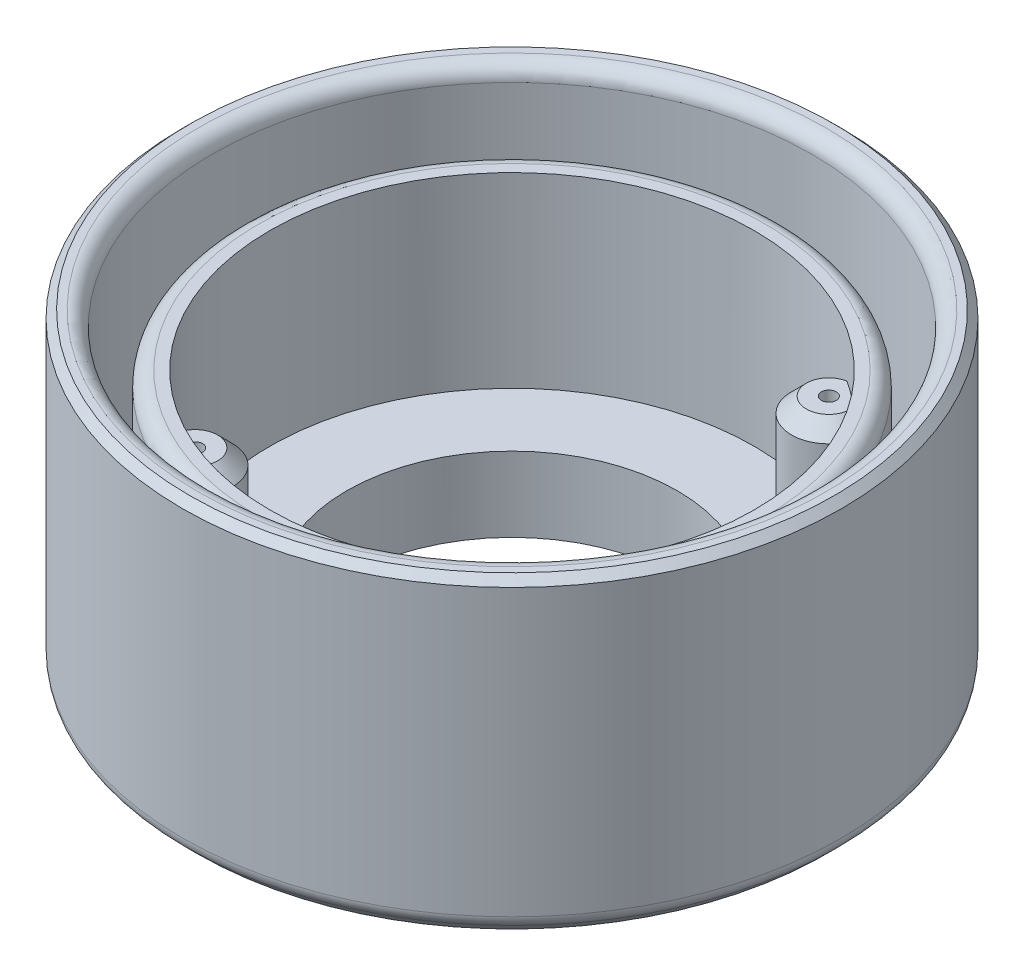
ISO-10303-21;
HEADER;
FILE_DESCRIPTION(('STEP AP214'),'2;1');
FILE_NAME('part.step','',(''),(''),'','','');
FILE_SCHEMA(('AUTOMOTIVE_DESIGN { 1 0 10303 214 1 1 1 1 }'));
ENDSEC;
DATA;
#1=APPLICATION_CONTEXT('core data for automotive mechanical design processes');
#2=APPLICATION_PROTOCOL_DEFINITION('international standard','automotive_design',2000,#1);
#3=PRODUCT_CONTEXT('',#1,'mechanical');
#4=PRODUCT('Part','Part','',(#3));
#5=PRODUCT_RELATED_PRODUCT_CATEGORY('part','',(#4));
#6=PRODUCT_DEFINITION_FORMATION('','',#4);
#7=PRODUCT_DEFINITION_CONTEXT('part definition',#1,'design');
#8=PRODUCT_DEFINITION('design','',#6,#7);
#9=PRODUCT_DEFINITION_SHAPE('','',#8);
#10=(LENGTH_UNIT() NAMED_UNIT(*) SI_UNIT(.MILLI.,.METRE.));
#11=(NAMED_UNIT(*) PLANE_ANGLE_UNIT() SI_UNIT($,.RADIAN.));
#12=(NAMED_UNIT(*) SI_UNIT($,.STERADIAN.) SOLID_ANGLE_UNIT());
#13=UNCERTAINTY_MEASURE_WITH_UNIT(LENGTH_MEASURE(1.E-05),#10,'distance_accuracy_value','');
#14=(GEOMETRIC_REPRESENTATION_CONTEXT(3) GLOBAL_UNCERTAINTY_ASSIGNED_CONTEXT((#13)) GLOBAL_UNIT_ASSIGNED_CONTEXT((#10,
#11,#12)) REPRESENTATION_CONTEXT('',''));
#15=CARTESIAN_POINT('',(0.,0.,0.));
#16=DIRECTION('',(0.,0.,1.));
#17=DIRECTION('',(1.,0.,0.));
#18=AXIS2_PLACEMENT_3D('',#15,#16,#17);
#19=CARTESIAN_POINT('',(9.1,16.001,-12.1));
#20=DIRECTION('',(0.,-1.,0.));
#21=DIRECTION('',(0.,0.,-1.));
#22=AXIS2_PLACEMENT_3D('',#19,#20,#21);
#23=CYLINDRICAL_SURFACE('',#22,0.500000000000001);
#24=CARTESIAN_POINT('',(9.1,0.65470053837925,-12.1));
#25=DIRECTION('',(0.,-1.,0.));
#26=DIRECTION('',(0.,0.,-1.));
#27=AXIS2_PLACEMENT_3D('',#24,#25,#26);
#28=CIRCLE('',#27,0.500000000000001);
#29=CARTESIAN_POINT('',(9.1,0.65470053837925,-12.6));
#30=VERTEX_POINT('',#29);
#31=EDGE_CURVE('E11',#30,#30,#28,.T.);
#32=ORIENTED_EDGE('',*,*,#31,.T.);
#33=EDGE_LOOP('',(#32));
#34=FACE_BOUND('',#33,.T.);
#35=CARTESIAN_POINT('',(9.1,9.5,-12.1));
#36=DIRECTION('',(0.,-1.,0.));
#37=DIRECTION('',(0.,0.,-1.));
#38=AXIS2_PLACEMENT_3D('',#35,#36,#37);
#39=CIRCLE('',#38,0.500000000000001);
#40=CARTESIAN_POINT('',(9.1,9.5,-12.6));
#41=VERTEX_POINT('',#40);
#42=EDGE_CURVE('E116',#41,#41,#39,.T.);
#43=ORIENTED_EDGE('',*,*,#42,.F.);
#44=EDGE_LOOP('',(#43));
#45=FACE_BOUND('',#44,.T.);
#46=ADVANCED_FACE('F35',(#34,#45),#23,.F.);
#47=CARTESIAN_POINT('',(-9.1,16.001,12.1));
#48=DIRECTION('',(0.,-1.,0.));
#49=DIRECTION('',(0.,0.,-1.));
#50=AXIS2_PLACEMENT_3D('',#47,#48,#49);
#51=CYLINDRICAL_SURFACE('',#50,0.500000000000001);
#52=CARTESIAN_POINT('',(-9.1,0.65470053837925,12.1));
#53=DIRECTION('',(0.,-1.,0.));
#54=DIRECTION('',(0.,0.,-1.));
#55=AXIS2_PLACEMENT_3D('',#52,#53,#54);
#56=CIRCLE('',#55,0.500000000000001);
#57=CARTESIAN_POINT('',(-9.1,0.65470053837925,11.6));
#58=VERTEX_POINT('',#57);
#59=EDGE_CURVE('E43',#58,#58,#56,.T.);
#60=ORIENTED_EDGE('',*,*,#59,.T.);
#61=EDGE_LOOP('',(#60));
#62=FACE_BOUND('',#61,.T.);
#63=CARTESIAN_POINT('',(-9.1,9.5,12.1));
#64=DIRECTION('',(0.,-1.,0.));
#65=DIRECTION('',(0.,0.,-1.));
#66=AXIS2_PLACEMENT_3D('',#63,#64,#65);
#67=CIRCLE('',#66,0.500000000000001);
#68=CARTESIAN_POINT('',(-9.1,9.5,11.6));
#69=VERTEX_POINT('',#68);
#70=EDGE_CURVE('E111',#69,#69,#67,.T.);
#71=ORIENTED_EDGE('',*,*,#70,.F.);
#72=EDGE_LOOP('',(#71));
#73=FACE_BOUND('',#72,.T.);
#74=ADVANCED_FACE('F247',(#62,#73),#51,.F.);
#75=CARTESIAN_POINT('',(0.,16.,0.));
#76=DIRECTION('',(0.,-1.,0.));
#77=DIRECTION('',(0.,0.,-1.));
#78=AXIS2_PLACEMENT_3D('',#75,#76,#77);
#79=CYLINDRICAL_SURFACE('',#78,20.05);
#80=CARTESIAN_POINT('',(0.,15.,0.));
#81=DIRECTION('',(0.,1.,0.));
#82=DIRECTION('',(0.,0.,1.));
#83=AXIS2_PLACEMENT_3D('',#80,#81,#82);
#84=CIRCLE('',#83,20.05);
#85=CARTESIAN_POINT('',(0.,15.,20.05));
#86=VERTEX_POINT('',#85);
#87=EDGE_CURVE('E160',#86,#86,#84,.T.);
#88=ORIENTED_EDGE('',*,*,#87,.T.);
#89=EDGE_LOOP('',(#88));
#90=FACE_BOUND('',#89,.T.);
#91=CARTESIAN_POINT('',(0.,0.,0.));
#92=DIRECTION('',(0.,1.,0.));
#93=DIRECTION('',(0.,0.,1.));
#94=AXIS2_PLACEMENT_3D('',#91,#92,#93);
#95=CIRCLE('',#94,20.05);
#96=CARTESIAN_POINT('',(0.,0.,20.05));
#97=VERTEX_POINT('',#96);
#98=EDGE_CURVE('E99',#97,#97,#95,.T.);
#99=ORIENTED_EDGE('',*,*,#98,.F.);
#100=EDGE_LOOP('',(#99));
#101=FACE_BOUND('',#100,.T.);
#102=ADVANCED_FACE('F253',(#90,#101),#79,.F.);
#103=CARTESIAN_POINT('',(0.,16.,0.));
#104=DIRECTION('',(0.,-1.,0.));
#105=DIRECTION('',(0.,0.,-1.));
#106=AXIS2_PLACEMENT_3D('',#103,#104,#105);
#107=CYLINDRICAL_SURFACE('',#106,22.05);
#108=CARTESIAN_POINT('',(0.,15.5,0.));
#109=DIRECTION('',(0.,1.,0.));
#110=DIRECTION('',(0.,0.,1.));
#111=AXIS2_PLACEMENT_3D('',#108,#109,#110);
#112=CIRCLE('',#111,22.05);
#113=CARTESIAN_POINT('',(0.,15.5,22.05));
#114=VERTEX_POINT('',#113);
#115=EDGE_CURVE('E372',#114,#114,#112,.F.);
#116=ORIENTED_EDGE('',*,*,#115,.T.);
#117=EDGE_LOOP('',(#116));
#118=FACE_BOUND('',#117,.T.);
#119=CARTESIAN_POINT('',(0.,-3.5857864376269,0.));
#120=DIRECTION('',(0.,-1.,0.));
#121=DIRECTION('',(0.,0.,-1.));
#122=AXIS2_PLACEMENT_3D('',#119,#120,#121);
#123=CIRCLE('',#122,22.05);
#124=CARTESIAN_POINT('',(0.,-3.5857864376269,-22.05));
#125=VERTEX_POINT('',#124);
#126=EDGE_CURVE('E363',#125,#125,#123,.F.);
#127=ORIENTED_EDGE('',*,*,#126,.T.);
#128=EDGE_LOOP('',(#127));
#129=FACE_BOUND('',#128,.T.);
#130=ADVANCED_FACE('F324',(#118,#129),#107,.T.);
#131=CARTESIAN_POINT('',(0.,16.,0.));
#132=DIRECTION('',(0.,1.,0.));
#133=DIRECTION('',(0.,0.,1.));
#134=AXIS2_PLACEMENT_3D('',#131,#132,#133);
#135=PLANE('',#134);
#136=CARTESIAN_POINT('',(0.,16.,0.));
#137=DIRECTION('',(0.,1.,0.));
#138=DIRECTION('',(0.,0.,1.));
#139=AXIS2_PLACEMENT_3D('',#136,#137,#138);
#140=CIRCLE('',#139,21.55);
#141=CARTESIAN_POINT('',(0.,16.,21.55));
#142=VERTEX_POINT('',#141);
#143=EDGE_CURVE('E367',#142,#142,#140,.T.);
#144=ORIENTED_EDGE('',*,*,#143,.T.);
#145=EDGE_LOOP('',(#144));
#146=FACE_BOUND('',#145,.T.);
#147=CARTESIAN_POINT('',(0.,16.,0.));
#148=DIRECTION('',(0.,1.,0.));
#149=DIRECTION('',(0.,0.,1.));
#150=AXIS2_PLACEMENT_3D('',#147,#148,#149);
#151=CIRCLE('',#150,21.05);
#152=CARTESIAN_POINT('',(0.,16.,21.05));
#153=VERTEX_POINT('',#152);
#154=EDGE_CURVE('E163',#153,#153,#151,.F.);
#155=ORIENTED_EDGE('',*,*,#154,.T.);
#156=EDGE_LOOP('',(#155));
#157=FACE_BOUND('',#156,.T.);
#158=ADVANCED_FACE('F315',(#146,#157),#135,.T.);
#159=CARTESIAN_POINT('',(0.,-5.,0.));
#160=DIRECTION('',(0.,1.,0.));
#161=DIRECTION('',(0.,0.,1.));
#162=AXIS2_PLACEMENT_3D('',#159,#160,#161);
#163=PLANE('',#162);
#164=CARTESIAN_POINT('',(-9.1,-5.,12.1));
#165=DIRECTION('',(0.,1.,0.));
#166=DIRECTION('',(0.,0.,1.));
#167=AXIS2_PLACEMENT_3D('',#164,#165,#166);
#168=CIRCLE('',#167,3.50000000000001);
#169=CARTESIAN_POINT('',(-9.1,-5.,15.6));
#170=VERTEX_POINT('',#169);
#171=EDGE_CURVE('E175',#170,#170,#168,.T.);
#172=ORIENTED_EDGE('',*,*,#171,.T.);
#173=EDGE_LOOP('',(#172));
#174=FACE_BOUND('',#173,.T.);
#175=CARTESIAN_POINT('',(9.1,-5.,-12.1));
#176=DIRECTION('',(0.,1.,0.));
#177=DIRECTION('',(0.,0.,1.));
#178=AXIS2_PLACEMENT_3D('',#175,#176,#177);
#179=CIRCLE('',#178,3.50000000000001);
#180=CARTESIAN_POINT('',(9.1,-5.,-8.59999999999999));
#181=VERTEX_POINT('',#180);
#182=EDGE_CURVE('E172',#181,#181,#179,.T.);
#183=ORIENTED_EDGE('',*,*,#182,.T.);
#184=EDGE_LOOP('',(#183));
#185=FACE_BOUND('',#184,.T.);
#186=CARTESIAN_POINT('',(0.,-5.,0.));
#187=DIRECTION('',(0.,1.,0.));
#188=DIRECTION('',(0.,0.,1.));
#189=AXIS2_PLACEMENT_3D('',#186,#187,#188);
#190=CIRCLE('',#189,21.05);
#191=CARTESIAN_POINT('',(0.,-5.,21.05));
#192=VERTEX_POINT('',#191);
#193=EDGE_CURVE('E169',#192,#192,#190,.F.);
#194=ORIENTED_EDGE('',*,*,#193,.T.);
#195=EDGE_LOOP('',(#194));
#196=FACE_BOUND('',#195,.T.);
#197=CARTESIAN_POINT('',(0.,-5.,0.));
#198=DIRECTION('',(0.,-1.,0.));
#199=DIRECTION('',(0.,0.,-1.));
#200=AXIS2_PLACEMENT_3D('',#197,#198,#199);
#201=CIRCLE('',#200,11.05);
#202=CARTESIAN_POINT('',(0.,-5.,-11.05));
#203=VERTEX_POINT('',#202);
#204=EDGE_CURVE('E137',#203,#203,#201,.T.);
#205=ORIENTED_EDGE('',*,*,#204,.F.);
#206=EDGE_LOOP('',(#205));
#207=FACE_BOUND('',#206,.T.);
#208=ADVANCED_FACE('F211',(#174,#185,#196,#207),#163,.F.);
#209=CARTESIAN_POINT('',(0.,0.,0.));
#210=DIRECTION('',(0.,1.,0.));
#211=DIRECTION('',(0.,0.,1.));
#212=AXIS2_PLACEMENT_3D('',#209,#210,#211);
#213=PLANE('',#212);
#214=CARTESIAN_POINT('',(0.,0.,0.));
#215=DIRECTION('',(0.,1.,0.));
#216=DIRECTION('',(0.,0.,1.));
#217=AXIS2_PLACEMENT_3D('',#214,#215,#216);
#218=CIRCLE('',#217,17.95);
#219=CARTESIAN_POINT('',(0.,0.,17.95));
#220=VERTEX_POINT('',#219);
#221=EDGE_CURVE('E140',#220,#220,#218,.T.);
#222=ORIENTED_EDGE('',*,*,#221,.F.);
#223=EDGE_LOOP('',(#222));
#224=FACE_BOUND('',#223,.T.);
#225=ORIENTED_EDGE('',*,*,#98,.T.);
#226=EDGE_LOOP('',(#225));
#227=FACE_BOUND('',#226,.T.);
#228=ADVANCED_FACE('F209',(#224,#227),#213,.T.);
#229=CARTESIAN_POINT('',(0.,12.5,0.));
#230=DIRECTION('',(0.,-1.,0.));
#231=DIRECTION('',(0.,0.,-1.));
#232=AXIS2_PLACEMENT_3D('',#229,#230,#231);
#233=CYLINDRICAL_SURFACE('',#232,16.2);
#234=DIRECTION('',(0.,-1.,0.));
#235=VECTOR('',#234,1.);
#236=CARTESIAN_POINT('',(11.5022620922631,4.5,-11.4078028892897));
#237=LINE('',#236,#235);
#238=CARTESIAN_POINT('',(11.5022620922631,0.,-11.4078028892897));
#239=VERTEX_POINT('',#238);
#240=CARTESIAN_POINT('',(11.5022620922631,8.49999999999999,-11.4078028892897));
#241=VERTEX_POINT('',#240);
#242=EDGE_CURVE('E102',#239,#241,#237,.F.);
#243=ORIENTED_EDGE('',*,*,#242,.F.);
#244=CARTESIAN_POINT('',(0.,0.,0.));
#245=DIRECTION('',(0.,1.,0.));
#246=DIRECTION('',(0.,0.,1.));
#247=AXIS2_PLACEMENT_3D('',#244,#245,#246);
#248=CIRCLE('',#247,16.2);
#249=CARTESIAN_POINT('',(-7.76844290730063,0.,14.2158817804599));
#250=VERTEX_POINT('',#249);
#251=EDGE_CURVE('E89',#239,#250,#248,.F.);
#252=ORIENTED_EDGE('',*,*,#251,.T.);
#253=DIRECTION('',(0.,-1.,0.));
#254=VECTOR('',#253,1.);
#255=CARTESIAN_POINT('',(-7.76844290730063,4.5,14.2158817804599));
#256=LINE('',#255,#254);
#257=CARTESIAN_POINT('',(-7.76844290730063,8.5,14.2158817804599));
#258=VERTEX_POINT('',#257);
#259=EDGE_CURVE('E125',#258,#250,#256,.T.);
#260=ORIENTED_EDGE('',*,*,#259,.F.);
#261=CARTESIAN_POINT('',(-7.76844290730063,8.5,14.2158817804599));
#262=CARTESIAN_POINT('',(-7.81247468652991,8.54381522144629,14.1918198873833));
#263=CARTESIAN_POINT('',(-7.85649884431773,8.58749361655965,14.167496966905));
#264=CARTESIAN_POINT('',(-7.94457163531133,8.67451316758287,14.1182975543483));
#265=CARTESIAN_POINT('',(-7.98862026867492,8.71785432129071,14.0934210586595));
#266=CARTESIAN_POINT('',(-8.12077512561277,8.84719105426175,14.0179637830098));
#267=CARTESIAN_POINT('',(-8.20897653002175,8.93258610894497,13.9665081333763));
#268=CARTESIAN_POINT('',(-8.34187211886619,9.05882656341694,13.887254149242));
#269=CARTESIAN_POINT('',(-8.38628529959073,9.1006124085849,13.8604812810051));
#270=CARTESIAN_POINT('',(-8.47539598767432,9.18337063818377,13.8061720072056));
#271=CARTESIAN_POINT('',(-8.5200934733772,9.22434308361621,13.7786356592748));
#272=CARTESIAN_POINT('',(-8.60993843424265,9.30528603864698,13.7226735251238));
#273=CARTESIAN_POINT('',(-8.65508630234626,9.34525554225769,13.6942469054918));
#274=CARTESIAN_POINT('',(-8.74597654705594,9.42378367060105,13.6363771585225));
#275=CARTESIAN_POINT('',(-8.79171907631816,9.46234192295469,13.6069337668219));
#276=CARTESIAN_POINT('',(-8.83784072802111,9.5,13.5769131714883));
#277=B_SPLINE_CURVE_WITH_KNOTS('',3,(#261,#262,#263,#264,#265,#266,#267,#268,#269,#270,#271,
#272,#273,#274,#275,#276),.UNSPECIFIED.,.F.,.F.,(4,2,2,2,2,2,2,4),(0.,0.199842253612788,
0.399685811010657,0.798980888758756,0.998769122464609,1.1985423158633,1.39850846871384,
1.59852701061053),.UNSPECIFIED.);
#278=CARTESIAN_POINT('',(-8.83784072802112,9.5,13.5769131714883));
#279=VERTEX_POINT('',#278);
#280=EDGE_CURVE('E56',#258,#279,#277,.T.);
#281=ORIENTED_EDGE('',*,*,#280,.T.);
#282=CARTESIAN_POINT('',(0.,9.5,0.));
#283=DIRECTION('',(0.,-1.,0.));
#284=DIRECTION('',(0.,0.,-1.));
#285=AXIS2_PLACEMENT_3D('',#282,#283,#284);
#286=CIRCLE('',#285,16.2);
#287=CARTESIAN_POINT('',(-10.5916636782262,9.5,12.2579223576977));
#288=VERTEX_POINT('',#287);
#289=EDGE_CURVE('E150',#279,#288,#286,.T.);
#290=ORIENTED_EDGE('',*,*,#289,.T.);
#291=CARTESIAN_POINT('',(-10.5916636782262,9.5,12.2579223576977));
#292=CARTESIAN_POINT('',(-10.6333025952172,9.46234192295469,12.2219412030218));
#293=CARTESIAN_POINT('',(-10.6742817793258,9.42378367060105,12.1861641326005));
#294=CARTESIAN_POINT('',(-10.7550980049654,9.34525554225769,12.1148992613732));
#295=CARTESIAN_POINT('',(-10.7949353428363,9.30528603864698,12.0794113872559));
#296=CARTESIAN_POINT('',(-10.8736288281071,9.22434308361622,12.0086214668746));
#297=CARTESIAN_POINT('',(-10.9124858852226,9.18337063818377,11.9733192743387));
#298=CARTESIAN_POINT('',(-10.9893876740641,9.1006124085849,11.902776189459));
#299=CARTESIAN_POINT('',(-11.0274323444123,9.05882656341694,11.8675353019305));
#300=CARTESIAN_POINT('',(-11.1404481014865,8.93258610894497,11.7618476953325));
#301=CARTESIAN_POINT('',(-11.214356017387,8.84719105426175,11.6913864181218));
#302=CARTESIAN_POINT('',(-11.3235186129058,8.71785432129071,11.5853570146511));
#303=CARTESIAN_POINT('',(-11.3596402208044,8.67451316758288,11.549940188399));
#304=CARTESIAN_POINT('',(-11.4313448021691,8.58749361655966,11.478976453149));
#305=CARTESIAN_POINT('',(-11.4669277791478,8.5438152214463,11.4434295450013));
#306=CARTESIAN_POINT('',(-11.5022620922631,8.50000000000001,11.4078028892897));
#307=B_SPLINE_CURVE_WITH_KNOTS('',3,(#291,#292,#293,#294,#295,#296,#297,#298,#299,#300,#301,
#302,#303,#304,#305,#306),.UNSPECIFIED.,.F.,.F.,(4,2,2,2,2,2,2,4),(0.,0.200018541896695,
0.399984694747229,0.599757888145922,0.799546121851776,1.19884119959988,1.39868475699774,
1.59852701061053),.UNSPECIFIED.);
#308=CARTESIAN_POINT('',(-11.5022620922631,8.5,11.4078028892897));
#309=VERTEX_POINT('',#308);
#310=EDGE_CURVE('E220',#288,#309,#307,.T.);
#311=ORIENTED_EDGE('',*,*,#310,.T.);
#312=DIRECTION('',(0.,-1.,0.));
#313=VECTOR('',#312,1.);
#314=CARTESIAN_POINT('',(-11.5022620922631,4.5,11.4078028892897));
#315=LINE('',#314,#313);
#316=CARTESIAN_POINT('',(-11.5022620922631,0.,11.4078028892897));
#317=VERTEX_POINT('',#316);
#318=EDGE_CURVE('E127',#317,#309,#315,.F.);
#319=ORIENTED_EDGE('',*,*,#318,.F.);
#320=CARTESIAN_POINT('',(7.76844290730063,0.,-14.2158817804599));
#321=VERTEX_POINT('',#320);
#322=EDGE_CURVE('E98',#317,#321,#248,.F.);
#323=ORIENTED_EDGE('',*,*,#322,.T.);
#324=DIRECTION('',(0.,-1.,0.));
#325=VECTOR('',#324,1.);
#326=CARTESIAN_POINT('',(7.76844290730063,4.5,-14.2158817804599));
#327=LINE('',#326,#325);
#328=CARTESIAN_POINT('',(7.76844290730063,8.49999999999999,-14.2158817804599));
#329=VERTEX_POINT('',#328);
#330=EDGE_CURVE('E112',#329,#321,#327,.T.);
#331=ORIENTED_EDGE('',*,*,#330,.F.);
#332=CARTESIAN_POINT('',(7.76844290730063,8.49999999999999,-14.2158817804599));
#333=CARTESIAN_POINT('',(7.8124746865299,8.54381522144629,-14.1918198873833));
#334=CARTESIAN_POINT('',(7.85649884431773,8.58749361655965,-14.167496966905));
#335=CARTESIAN_POINT('',(7.94457163531133,8.67451316758287,-14.1182975543483));
#336=CARTESIAN_POINT('',(7.98862026867492,8.7178543212907,-14.0934210586595));
#337=CARTESIAN_POINT('',(8.12077512561277,8.84719105426175,-14.0179637830098));
#338=CARTESIAN_POINT('',(8.20897653002176,8.93258610894496,-13.9665081333763));
#339=CARTESIAN_POINT('',(8.3418721188662,9.05882656341694,-13.887254149242));
#340=CARTESIAN_POINT('',(8.38628529959074,9.1006124085849,-13.8604812810051));
#341=CARTESIAN_POINT('',(8.47539598767433,9.18337063818377,-13.8061720072056));
#342=CARTESIAN_POINT('',(8.52009347337722,9.22434308361621,-13.7786356592748));
#343=CARTESIAN_POINT('',(8.60993843424267,9.30528603864698,-13.7226735251238));
#344=CARTESIAN_POINT('',(8.65508630234627,9.34525554225769,-13.6942469054918));
#345=CARTESIAN_POINT('',(8.74597654705596,9.42378367060105,-13.6363771585224));
#346=CARTESIAN_POINT('',(8.79171907631818,9.46234192295469,-13.6069337668219));
#347=CARTESIAN_POINT('',(8.83784072802113,9.5,-13.5769131714882));
#348=B_SPLINE_CURVE_WITH_KNOTS('',3,(#332,#333,#334,#335,#336,#337,#338,#339,#340,#341,#342,
#343,#344,#345,#346,#347),.UNSPECIFIED.,.F.,.F.,(4,2,2,2,2,2,2,4),(0.,0.199842253612789,
0.39968581101066,0.798980888758767,0.998769122464625,1.19854231586332,1.39850846871386,
1.59852701061056),.UNSPECIFIED.);
#349=CARTESIAN_POINT('',(8.83784072802116,9.5,-13.5769131714882));
#350=VERTEX_POINT('',#349);
#351=EDGE_CURVE('E189',#329,#350,#348,.T.);
#352=ORIENTED_EDGE('',*,*,#351,.T.);
#353=CARTESIAN_POINT('',(0.,9.5,0.));
#354=DIRECTION('',(0.,-1.,0.));
#355=DIRECTION('',(0.,0.,-1.));
#356=AXIS2_PLACEMENT_3D('',#353,#354,#355);
#357=CIRCLE('',#356,16.2);
#358=CARTESIAN_POINT('',(10.5916636782261,9.5,-12.2579223576977));
#359=VERTEX_POINT('',#358);
#360=EDGE_CURVE('E152',#350,#359,#357,.T.);
#361=ORIENTED_EDGE('',*,*,#360,.T.);
#362=CARTESIAN_POINT('',(10.5916636782261,9.5,-12.2579223576977));
#363=CARTESIAN_POINT('',(10.6333025952172,9.46234192295469,-12.2219412030218));
#364=CARTESIAN_POINT('',(10.6742817793258,9.42378367060105,-12.1861641326005));
#365=CARTESIAN_POINT('',(10.7550980049654,9.34525554225769,-12.1148992613732));
#366=CARTESIAN_POINT('',(10.7949353428363,9.30528603864698,-12.0794113872559));
#367=CARTESIAN_POINT('',(10.8736288281071,9.22434308361621,-12.0086214668746));
#368=CARTESIAN_POINT('',(10.9124858852226,9.18337063818377,-11.9733192743387));
#369=CARTESIAN_POINT('',(10.9893876740641,9.1006124085849,-11.902776189459));
#370=CARTESIAN_POINT('',(11.0274323444123,9.05882656341694,-11.8675353019305));
#371=CARTESIAN_POINT('',(11.1404481014865,8.93258610894496,-11.7618476953325));
#372=CARTESIAN_POINT('',(11.214356017387,8.84719105426175,-11.6913864181218));
#373=CARTESIAN_POINT('',(11.3235186129058,8.7178543212907,-11.5853570146511));
#374=CARTESIAN_POINT('',(11.3596402208044,8.67451316758287,-11.549940188399));
#375=CARTESIAN_POINT('',(11.4313448021691,8.58749361655965,-11.478976453149));
#376=CARTESIAN_POINT('',(11.4669277791478,8.54381522144629,-11.4434295450013));
#377=CARTESIAN_POINT('',(11.5022620922631,8.5,-11.4078028892897));
#378=B_SPLINE_CURVE_WITH_KNOTS('',3,(#362,#363,#364,#365,#366,#367,#368,#369,#370,#371,#372,
#373,#374,#375,#376,#377),.UNSPECIFIED.,.F.,.F.,(4,2,2,2,2,2,2,4),(0.,0.200018541896699,
0.399984694747236,0.599757888145933,0.799546121851789,1.19884119959989,1.39868475699776,
1.59852701061056),.UNSPECIFIED.);
#379=EDGE_CURVE('E107',#359,#241,#378,.T.);
#380=ORIENTED_EDGE('',*,*,#379,.T.);
#381=EDGE_LOOP('',(#243,#252,#260,#281,#290,#311,#319,#323,#331,#352,#361,#380));
#382=FACE_BOUND('',#381,.T.);
#383=CARTESIAN_POINT('',(0.,12.5,0.));
#384=DIRECTION('',(0.,1.,0.));
#385=DIRECTION('',(0.,0.,1.));
#386=AXIS2_PLACEMENT_3D('',#383,#384,#385);
#387=CIRCLE('',#386,16.2);
#388=CARTESIAN_POINT('',(0.,12.5,16.2));
#389=VERTEX_POINT('',#388);
#390=EDGE_CURVE('E143',#389,#389,#387,.T.);
#391=ORIENTED_EDGE('',*,*,#390,.T.);
#392=EDGE_LOOP('',(#391));
#393=FACE_BOUND('',#392,.T.);
#394=ADVANCED_FACE('F103',(#382,#393),#233,.F.);
#395=CARTESIAN_POINT('',(0.,12.5,0.));
#396=DIRECTION('',(0.,-1.,0.));
#397=DIRECTION('',(0.,0.,-1.));
#398=AXIS2_PLACEMENT_3D('',#395,#396,#397);
#399=CYLINDRICAL_SURFACE('',#398,17.95);
#400=CARTESIAN_POINT('',(0.,11.5,0.));
#401=DIRECTION('',(0.,1.,0.));
#402=DIRECTION('',(0.,0.,1.));
#403=AXIS2_PLACEMENT_3D('',#400,#401,#402);
#404=CIRCLE('',#403,17.95);
#405=CARTESIAN_POINT('',(0.,11.5,17.95));
#406=VERTEX_POINT('',#405);
#407=EDGE_CURVE('E157',#406,#406,#404,.F.);
#408=ORIENTED_EDGE('',*,*,#407,.T.);
#409=EDGE_LOOP('',(#408));
#410=FACE_BOUND('',#409,.T.);
#411=ORIENTED_EDGE('',*,*,#221,.T.);
#412=EDGE_LOOP('',(#411));
#413=FACE_BOUND('',#412,.T.);
#414=ADVANCED_FACE('F208',(#410,#413),#399,.T.);
#415=CARTESIAN_POINT('',(0.,12.5,0.));
#416=DIRECTION('',(0.,1.,0.));
#417=DIRECTION('',(0.,0.,1.));
#418=AXIS2_PLACEMENT_3D('',#415,#416,#417);
#419=PLANE('',#418);
#420=CARTESIAN_POINT('',(0.,12.5,0.));
#421=DIRECTION('',(0.,1.,0.));
#422=DIRECTION('',(0.,0.,1.));
#423=AXIS2_PLACEMENT_3D('',#420,#421,#422);
#424=CIRCLE('',#423,16.95);
#425=CARTESIAN_POINT('',(0.,12.5,16.95));
#426=VERTEX_POINT('',#425);
#427=EDGE_CURVE('E154',#426,#426,#424,.T.);
#428=ORIENTED_EDGE('',*,*,#427,.T.);
#429=EDGE_LOOP('',(#428));
#430=FACE_BOUND('',#429,.T.);
#431=ORIENTED_EDGE('',*,*,#390,.F.);
#432=EDGE_LOOP('',(#431));
#433=FACE_BOUND('',#432,.T.);
#434=ADVANCED_FACE('F264',(#430,#433),#419,.T.);
#435=CARTESIAN_POINT('',(9.1,0.,-12.1));
#436=DIRECTION('',(0.,1.,0.));
#437=DIRECTION('',(0.,0.,1.));
#438=AXIS2_PLACEMENT_3D('',#435,#436,#437);
#439=CIRCLE('',#438,2.5);
#440=EDGE_CURVE('E94',#321,#239,#439,.T.);
#441=ORIENTED_EDGE('',*,*,#440,.F.);
#442=ORIENTED_EDGE('',*,*,#322,.F.);
#443=CARTESIAN_POINT('',(-9.1,0.,12.1));
#444=DIRECTION('',(0.,1.,0.));
#445=DIRECTION('',(0.,0.,1.));
#446=AXIS2_PLACEMENT_3D('',#443,#444,#445);
#447=CIRCLE('',#446,2.5);
#448=EDGE_CURVE('E97',#250,#317,#447,.T.);
#449=ORIENTED_EDGE('',*,*,#448,.F.);
#450=ORIENTED_EDGE('',*,*,#251,.F.);
#451=EDGE_LOOP('',(#441,#442,#449,#450));
#452=FACE_BOUND('',#451,.T.);
#453=CARTESIAN_POINT('',(0.,0.,0.));
#454=DIRECTION('',(0.,1.,0.));
#455=DIRECTION('',(0.,0.,1.));
#456=AXIS2_PLACEMENT_3D('',#453,#454,#455);
#457=CIRCLE('',#456,11.05);
#458=CARTESIAN_POINT('',(0.,0.,11.05));
#459=VERTEX_POINT('',#458);
#460=EDGE_CURVE('E136',#459,#459,#457,.F.);
#461=ORIENTED_EDGE('',*,*,#460,.T.);
#462=EDGE_LOOP('',(#461));
#463=FACE_BOUND('',#462,.T.);
#464=ADVANCED_FACE('F91',(#452,#463),#213,.T.);
#465=CARTESIAN_POINT('',(0.,16.001,0.));
#466=DIRECTION('',(0.,-1.,0.));
#467=DIRECTION('',(0.,0.,-1.));
#468=AXIS2_PLACEMENT_3D('',#465,#466,#467);
#469=CYLINDRICAL_SURFACE('',#468,11.05);
#470=ORIENTED_EDGE('',*,*,#460,.F.);
#471=EDGE_LOOP('',(#470));
#472=FACE_BOUND('',#471,.T.);
#473=ORIENTED_EDGE('',*,*,#204,.T.);
#474=EDGE_LOOP('',(#473));
#475=FACE_BOUND('',#474,.T.);
#476=ADVANCED_FACE('F261',(#472,#475),#469,.F.);
#477=CARTESIAN_POINT('',(-9.1,-0.5,12.1));
#478=DIRECTION('',(0.,-1.,0.));
#479=DIRECTION('',(0.,0.,-1.));
#480=AXIS2_PLACEMENT_3D('',#477,#478,#479);
#481=CYLINDRICAL_SURFACE('',#480,2.5);
#482=CARTESIAN_POINT('',(-9.1,-3.99999999999999,12.1));
#483=DIRECTION('',(0.,1.,0.));
#484=DIRECTION('',(0.,0.,1.));
#485=AXIS2_PLACEMENT_3D('',#482,#483,#484);
#486=CIRCLE('',#485,2.5);
#487=CARTESIAN_POINT('',(-9.1,-3.99999999999999,14.6));
#488=VERTEX_POINT('',#487);
#489=EDGE_CURVE('E166',#488,#488,#486,.F.);
#490=ORIENTED_EDGE('',*,*,#489,.T.);
#491=EDGE_LOOP('',(#490));
#492=FACE_BOUND('',#491,.T.);
#493=CARTESIAN_POINT('',(-9.1,-0.5,12.1));
#494=DIRECTION('',(0.,-1.,0.));
#495=DIRECTION('',(0.,0.,-1.));
#496=AXIS2_PLACEMENT_3D('',#493,#494,#495);
#497=CIRCLE('',#496,2.5);
#498=CARTESIAN_POINT('',(-9.1,-0.5,9.59999999999999));
#499=VERTEX_POINT('',#498);
#500=EDGE_CURVE('E133',#499,#499,#497,.T.);
#501=ORIENTED_EDGE('',*,*,#500,.F.);
#502=EDGE_LOOP('',(#501));
#503=FACE_BOUND('',#502,.T.);
#504=ADVANCED_FACE('F258',(#492,#503),#481,.F.);
#505=CARTESIAN_POINT('',(9.1,-0.5,-12.1));
#506=DIRECTION('',(0.,-1.,0.));
#507=DIRECTION('',(0.,0.,-1.));
#508=AXIS2_PLACEMENT_3D('',#505,#506,#507);
#509=CYLINDRICAL_SURFACE('',#508,2.5);
#510=CARTESIAN_POINT('',(9.1,-3.99999999999999,-12.1));
#511=DIRECTION('',(0.,1.,0.));
#512=DIRECTION('',(0.,0.,1.));
#513=AXIS2_PLACEMENT_3D('',#510,#511,#512);
#514=CIRCLE('',#513,2.5);
#515=CARTESIAN_POINT('',(9.1,-3.99999999999999,-9.6));
#516=VERTEX_POINT('',#515);
#517=EDGE_CURVE('E178',#516,#516,#514,.F.);
#518=ORIENTED_EDGE('',*,*,#517,.T.);
#519=EDGE_LOOP('',(#518));
#520=FACE_BOUND('',#519,.T.);
#521=CARTESIAN_POINT('',(9.1,-0.5,-12.1));
#522=DIRECTION('',(0.,-1.,0.));
#523=DIRECTION('',(0.,0.,-1.));
#524=AXIS2_PLACEMENT_3D('',#521,#522,#523);
#525=CIRCLE('',#524,2.5);
#526=CARTESIAN_POINT('',(9.1,-0.5,-14.6));
#527=VERTEX_POINT('',#526);
#528=EDGE_CURVE('E130',#527,#527,#525,.T.);
#529=ORIENTED_EDGE('',*,*,#528,.F.);
#530=EDGE_LOOP('',(#529));
#531=FACE_BOUND('',#530,.T.);
#532=ADVANCED_FACE('F333',(#520,#531),#509,.F.);
#533=CARTESIAN_POINT('',(-9.1,9.5,12.1));
#534=DIRECTION('',(0.,-1.,0.));
#535=DIRECTION('',(0.,0.,-1.));
#536=AXIS2_PLACEMENT_3D('',#533,#534,#535);
#537=PLANE('',#536);
#538=ORIENTED_EDGE('',*,*,#70,.T.);
#539=EDGE_LOOP('',(#538));
#540=FACE_BOUND('',#539,.T.);
#541=ORIENTED_EDGE('',*,*,#289,.F.);
#542=CARTESIAN_POINT('',(-9.1,9.5,12.1));
#543=DIRECTION('',(0.,-1.,0.));
#544=DIRECTION('',(0.,0.,-1.));
#545=AXIS2_PLACEMENT_3D('',#542,#543,#544);
#546=CIRCLE('',#545,1.5);
#547=EDGE_CURVE('E49',#279,#288,#546,.F.);
#548=ORIENTED_EDGE('',*,*,#547,.T.);
#549=EDGE_LOOP('',(#541,#548));
#550=FACE_BOUND('',#549,.T.);
#551=ADVANCED_FACE('F336',(#540,#550),#537,.F.);
#552=CARTESIAN_POINT('',(-9.1,9.5,12.1));
#553=DIRECTION('',(0.,-1.,0.));
#554=DIRECTION('',(0.,0.,-1.));
#555=AXIS2_PLACEMENT_3D('',#552,#553,#554);
#556=CYLINDRICAL_SURFACE('',#555,2.5);
#557=ORIENTED_EDGE('',*,*,#318,.T.);
#558=CARTESIAN_POINT('',(-9.1,8.5,12.1));
#559=DIRECTION('',(0.,-1.,0.));
#560=DIRECTION('',(0.,0.,-1.));
#561=AXIS2_PLACEMENT_3D('',#558,#559,#560);
#562=CIRCLE('',#561,2.5);
#563=EDGE_CURVE('E185',#309,#258,#562,.T.);
#564=ORIENTED_EDGE('',*,*,#563,.T.);
#565=ORIENTED_EDGE('',*,*,#259,.T.);
#566=ORIENTED_EDGE('',*,*,#448,.T.);
#567=EDGE_LOOP('',(#557,#564,#565,#566));
#568=FACE_BOUND('',#567,.T.);
#569=ADVANCED_FACE('F344',(#568),#556,.T.);
#570=CARTESIAN_POINT('',(9.1,9.5,-12.1));
#571=DIRECTION('',(0.,-1.,0.));
#572=DIRECTION('',(0.,0.,-1.));
#573=AXIS2_PLACEMENT_3D('',#570,#571,#572);
#574=PLANE('',#573);
#575=ORIENTED_EDGE('',*,*,#42,.T.);
#576=EDGE_LOOP('',(#575));
#577=FACE_BOUND('',#576,.T.);
#578=ORIENTED_EDGE('',*,*,#360,.F.);
#579=CARTESIAN_POINT('',(9.1,9.5,-12.1));
#580=DIRECTION('',(0.,-1.,0.));
#581=DIRECTION('',(0.,0.,-1.));
#582=AXIS2_PLACEMENT_3D('',#579,#580,#581);
#583=CIRCLE('',#582,1.49999999999998);
#584=EDGE_CURVE('E183',#350,#359,#583,.F.);
#585=ORIENTED_EDGE('',*,*,#584,.T.);
#586=EDGE_LOOP('',(#578,#585));
#587=FACE_BOUND('',#586,.T.);
#588=ADVANCED_FACE('F288',(#577,#587),#574,.F.);
#589=CARTESIAN_POINT('',(9.1,9.5,-12.1));
#590=DIRECTION('',(0.,-1.,0.));
#591=DIRECTION('',(0.,0.,-1.));
#592=AXIS2_PLACEMENT_3D('',#589,#590,#591);
#593=CYLINDRICAL_SURFACE('',#592,2.5);
#594=ORIENTED_EDGE('',*,*,#242,.T.);
#595=CARTESIAN_POINT('',(9.1,8.49999999999999,-12.1));
#596=DIRECTION('',(0.,-1.,0.));
#597=DIRECTION('',(0.,0.,-1.));
#598=AXIS2_PLACEMENT_3D('',#595,#596,#597);
#599=CIRCLE('',#598,2.5);
#600=EDGE_CURVE('E181',#241,#329,#599,.T.);
#601=ORIENTED_EDGE('',*,*,#600,.T.);
#602=ORIENTED_EDGE('',*,*,#330,.T.);
#603=ORIENTED_EDGE('',*,*,#440,.T.);
#604=EDGE_LOOP('',(#594,#601,#602,#603));
#605=FACE_BOUND('',#604,.T.);
#606=ADVANCED_FACE('F114',(#605),#593,.T.);
#607=CARTESIAN_POINT('',(0.,11.5,0.));
#608=DIRECTION('',(0.,1.,0.));
#609=DIRECTION('',(0.,0.,1.));
#610=AXIS2_PLACEMENT_3D('',#607,#608,#609);
#611=TOROIDAL_SURFACE('',#610,16.95,1.);
#612=ORIENTED_EDGE('',*,*,#407,.F.);
#613=EDGE_LOOP('',(#612));
#614=FACE_BOUND('',#613,.T.);
#615=ORIENTED_EDGE('',*,*,#427,.F.);
#616=EDGE_LOOP('',(#615));
#617=FACE_BOUND('',#616,.T.);
#618=ADVANCED_FACE('F276',(#614,#617),#611,.T.);
#619=CARTESIAN_POINT('',(0.,15.,0.));
#620=DIRECTION('',(0.,1.,0.));
#621=DIRECTION('',(0.,0.,1.));
#622=AXIS2_PLACEMENT_3D('',#619,#620,#621);
#623=TOROIDAL_SURFACE('',#622,21.05,1.);
#624=ORIENTED_EDGE('',*,*,#154,.F.);
#625=EDGE_LOOP('',(#624));
#626=FACE_BOUND('',#625,.T.);
#627=ORIENTED_EDGE('',*,*,#87,.F.);
#628=EDGE_LOOP('',(#627));
#629=FACE_BOUND('',#628,.T.);
#630=ADVANCED_FACE('F278',(#626,#629),#623,.T.);
#631=CARTESIAN_POINT('',(-9.1,-3.99999999999999,12.1));
#632=DIRECTION('',(0.,-1.,0.));
#633=DIRECTION('',(0.,0.,-1.));
#634=AXIS2_PLACEMENT_3D('',#631,#632,#633);
#635=CONICAL_SURFACE('',#634,2.5,0.785398163397447);
#636=ORIENTED_EDGE('',*,*,#171,.F.);
#637=EDGE_LOOP('',(#636));
#638=FACE_BOUND('',#637,.T.);
#639=ORIENTED_EDGE('',*,*,#489,.F.);
#640=EDGE_LOOP('',(#639));
#641=FACE_BOUND('',#640,.T.);
#642=ADVANCED_FACE('F285',(#638,#641),#635,.F.);
#643=CARTESIAN_POINT('',(9.1,-3.99999999999999,-12.1));
#644=DIRECTION('',(0.,-1.,0.));
#645=DIRECTION('',(0.,0.,-1.));
#646=AXIS2_PLACEMENT_3D('',#643,#644,#645);
#647=CONICAL_SURFACE('',#646,2.5,0.785398163397447);
#648=ORIENTED_EDGE('',*,*,#182,.F.);
#649=EDGE_LOOP('',(#648));
#650=FACE_BOUND('',#649,.T.);
#651=ORIENTED_EDGE('',*,*,#517,.F.);
#652=EDGE_LOOP('',(#651));
#653=FACE_BOUND('',#652,.T.);
#654=ADVANCED_FACE('F296',(#650,#653),#647,.F.);
#655=CARTESIAN_POINT('',(0.,-3.99999999999999,0.));
#656=DIRECTION('',(0.,1.,0.));
#657=DIRECTION('',(0.,0.,1.));
#658=AXIS2_PLACEMENT_3D('',#655,#656,#657);
#659=CONICAL_SURFACE('',#658,22.05,0.785398163397447);
#660=CARTESIAN_POINT('',(0.,-4.29289321881345,0.));
#661=DIRECTION('',(0.,1.,0.));
#662=DIRECTION('',(0.,0.,1.));
#663=AXIS2_PLACEMENT_3D('',#660,#661,#662);
#664=CIRCLE('',#663,21.7571067811866);
#665=CARTESIAN_POINT('',(0.,-4.29289321881345,21.7571067811866));
#666=VERTEX_POINT('',#665);
#667=EDGE_CURVE('E310',#666,#666,#664,.F.);
#668=ORIENTED_EDGE('',*,*,#667,.T.);
#669=EDGE_LOOP('',(#668));
#670=FACE_BOUND('',#669,.T.);
#671=ORIENTED_EDGE('',*,*,#193,.F.);
#672=EDGE_LOOP('',(#671));
#673=FACE_BOUND('',#672,.T.);
#674=ADVANCED_FACE('F299',(#670,#673),#659,.T.);
#675=CARTESIAN_POINT('',(9.1,8.49999999999999,-12.1));
#676=DIRECTION('',(0.,-1.,0.));
#677=DIRECTION('',(0.,0.,-1.));
#678=AXIS2_PLACEMENT_3D('',#675,#676,#677);
#679=CONICAL_SURFACE('',#678,2.5,0.785398163397454);
#680=ORIENTED_EDGE('',*,*,#379,.F.);
#681=ORIENTED_EDGE('',*,*,#584,.F.);
#682=ORIENTED_EDGE('',*,*,#351,.F.);
#683=ORIENTED_EDGE('',*,*,#600,.F.);
#684=EDGE_LOOP('',(#680,#681,#682,#683));
#685=FACE_BOUND('',#684,.T.);
#686=ADVANCED_FACE('F200',(#685),#679,.T.);
#687=CARTESIAN_POINT('',(-9.1,8.5,12.1));
#688=DIRECTION('',(0.,-1.,0.));
#689=DIRECTION('',(0.,0.,-1.));
#690=AXIS2_PLACEMENT_3D('',#687,#688,#689);
#691=CONICAL_SURFACE('',#690,2.5,0.785398163397451);
#692=ORIENTED_EDGE('',*,*,#310,.F.);
#693=ORIENTED_EDGE('',*,*,#547,.F.);
#694=ORIENTED_EDGE('',*,*,#280,.F.);
#695=ORIENTED_EDGE('',*,*,#563,.F.);
#696=EDGE_LOOP('',(#692,#693,#694,#695));
#697=FACE_BOUND('',#696,.T.);
#698=ADVANCED_FACE('F225',(#697),#691,.T.);
#699=CARTESIAN_POINT('',(0.,-3.5857864376269,0.));
#700=DIRECTION('',(0.,-1.,0.));
#701=DIRECTION('',(0.,0.,-1.));
#702=AXIS2_PLACEMENT_3D('',#699,#700,#701);
#703=TOROIDAL_SURFACE('',#702,21.05,1.);
#704=ORIENTED_EDGE('',*,*,#667,.F.);
#705=EDGE_LOOP('',(#704));
#706=FACE_BOUND('',#705,.T.);
#707=ORIENTED_EDGE('',*,*,#126,.F.);
#708=EDGE_LOOP('',(#707));
#709=FACE_BOUND('',#708,.T.);
#710=ADVANCED_FACE('F229',(#706,#709),#703,.T.);
#711=CARTESIAN_POINT('',(0.,16.,0.));
#712=DIRECTION('',(0.,-1.,0.));
#713=DIRECTION('',(0.,0.,-1.));
#714=AXIS2_PLACEMENT_3D('',#711,#712,#713);
#715=CONICAL_SURFACE('',#714,21.55,0.785398163397455);
#716=ORIENTED_EDGE('',*,*,#115,.F.);
#717=EDGE_LOOP('',(#716));
#718=FACE_BOUND('',#717,.T.);
#719=ORIENTED_EDGE('',*,*,#143,.F.);
#720=EDGE_LOOP('',(#719));
#721=FACE_BOUND('',#720,.T.);
#722=ADVANCED_FACE('F234',(#718,#721),#715,.T.);
#723=CARTESIAN_POINT('',(-9.1,0.65470053837925,12.1));
#724=DIRECTION('',(0.,-1.,0.));
#725=DIRECTION('',(0.,0.,-1.));
#726=AXIS2_PLACEMENT_3D('',#723,#724,#725);
#727=CONICAL_SURFACE('',#726,0.500000000000001,1.0471975511966);
#728=CARTESIAN_POINT('',(-9.1,-0.5,9.59999999999999));
#729=CARTESIAN_POINT('',(-9.1,-0.487971869391883,9.62083333333332));
#730=CARTESIAN_POINT('',(-9.1,-0.475943738783766,9.64166666666665));
#731=CARTESIAN_POINT('',(-9.1,-0.451887477567532,9.68333333333332));
#732=CARTESIAN_POINT('',(-9.1,-0.439859346959414,9.70416666666666));
#733=CARTESIAN_POINT('',(-9.1,-0.41580308574318,9.74583333333332));
#734=CARTESIAN_POINT('',(-9.1,-0.403774955135063,9.76666666666666));
#735=CARTESIAN_POINT('',(-9.1,-0.379718693918829,9.80833333333332));
#736=CARTESIAN_POINT('',(-9.1,-0.367690563310711,9.82916666666666));
#737=CARTESIAN_POINT('',(-9.1,-0.343634302094477,9.87083333333332));
#738=CARTESIAN_POINT('',(-9.1,-0.33160617148636,9.89166666666666));
#739=CARTESIAN_POINT('',(-9.1,-0.307549910270125,9.93333333333332));
#740=CARTESIAN_POINT('',(-9.1,-0.295521779662008,9.95416666666666));
#741=CARTESIAN_POINT('',(-9.1,-0.271465518445774,9.99583333333332));
#742=CARTESIAN_POINT('',(-9.1,-0.259437387837656,10.0166666666667));
#743=CARTESIAN_POINT('',(-9.1,-0.235381126621422,10.0583333333333));
#744=CARTESIAN_POINT('',(-9.1,-0.223352996013305,10.0791666666667));
#745=CARTESIAN_POINT('',(-9.1,-0.199296734797071,10.1208333333333));
#746=CARTESIAN_POINT('',(-9.1,-0.187268604188953,10.1416666666667));
#747=CARTESIAN_POINT('',(-9.1,-0.163212342972719,10.1833333333333));
#748=CARTESIAN_POINT('',(-9.1,-0.151184212364602,10.2041666666667));
#749=CARTESIAN_POINT('',(-9.1,-0.127127951148368,10.2458333333333));
#750=CARTESIAN_POINT('',(-9.1,-0.11509982054025,10.2666666666667));
#751=CARTESIAN_POINT('',(-9.1,-0.0910435593240158,10.3083333333333));
#752=CARTESIAN_POINT('',(-9.1,-0.0790154287158986,10.3291666666667));
#753=CARTESIAN_POINT('',(-9.1,-0.0549591674996642,10.3708333333333));
#754=CARTESIAN_POINT('',(-9.1,-0.042931036891547,10.3916666666667));
#755=CARTESIAN_POINT('',(-9.1,-0.0188747756753125,10.4333333333333));
#756=CARTESIAN_POINT('',(-9.1,-0.00684664506719526,10.4541666666667));
#757=CARTESIAN_POINT('',(-9.1,0.017209616149039,10.4958333333333));
#758=CARTESIAN_POINT('',(-9.1,0.029237746757156,10.5166666666667));
#759=CARTESIAN_POINT('',(-9.1,0.0532940079733903,10.5583333333333));
#760=CARTESIAN_POINT('',(-9.1,0.0653221385815077,10.5791666666667));
#761=CARTESIAN_POINT('',(-9.1,0.0893783997977422,10.6208333333333));
#762=CARTESIAN_POINT('',(-9.1,0.101406530405859,10.6416666666667));
#763=CARTESIAN_POINT('',(-9.1,0.125462791622094,10.6833333333333));
#764=CARTESIAN_POINT('',(-9.1,0.137490922230211,10.7041666666667));
#765=CARTESIAN_POINT('',(-9.1,0.161547183446445,10.7458333333333));
#766=CARTESIAN_POINT('',(-9.1,0.173575314054562,10.7666666666667));
#767=CARTESIAN_POINT('',(-9.1,0.197631575270797,10.8083333333333));
#768=CARTESIAN_POINT('',(-9.1,0.209659705878914,10.8291666666667));
#769=CARTESIAN_POINT('',(-9.1,0.233715967095149,10.8708333333333));
#770=CARTESIAN_POINT('',(-9.1,0.245744097703266,10.8916666666667));
#771=CARTESIAN_POINT('',(-9.1,0.2698003589195,10.9333333333333));
#772=CARTESIAN_POINT('',(-9.1,0.281828489527617,10.9541666666667));
#773=CARTESIAN_POINT('',(-9.1,0.305884750743852,10.9958333333333));
#774=CARTESIAN_POINT('',(-9.1,0.317912881351969,11.0166666666667));
#775=CARTESIAN_POINT('',(-9.1,0.341969142568203,11.0583333333333));
#776=CARTESIAN_POINT('',(-9.1,0.35399727317632,11.0791666666667));
#777=CARTESIAN_POINT('',(-9.1,0.378053534392555,11.1208333333333));
#778=CARTESIAN_POINT('',(-9.1,0.390081665000672,11.1416666666667));
#779=CARTESIAN_POINT('',(-9.1,0.414137926216907,11.1833333333333));
#780=CARTESIAN_POINT('',(-9.1,0.426166056825024,11.2041666666667));
#781=CARTESIAN_POINT('',(-9.1,0.450222318041258,11.2458333333333));
#782=CARTESIAN_POINT('',(-9.1,0.462250448649375,11.2666666666667));
#783=CARTESIAN_POINT('',(-9.1,0.486306709865609,11.3083333333333));
#784=CARTESIAN_POINT('',(-9.1,0.498334840473727,11.3291666666667));
#785=CARTESIAN_POINT('',(-9.1,0.522391101689961,11.3708333333333));
#786=CARTESIAN_POINT('',(-9.1,0.534419232298078,11.3916666666667));
#787=CARTESIAN_POINT('',(-9.1,0.558475493514313,11.4333333333333));
#788=CARTESIAN_POINT('',(-9.1,0.57050362412243,11.4541666666667));
#789=CARTESIAN_POINT('',(-9.1,0.594559885338664,11.4958333333333));
#790=CARTESIAN_POINT('',(-9.1,0.606588015946781,11.5166666666667));
#791=CARTESIAN_POINT('',(-9.1,0.630644277163016,11.5583333333333));
#792=CARTESIAN_POINT('',(-9.1,0.642672407771133,11.5791666666667));
#793=CARTESIAN_POINT('',(-9.1,0.65470053837925,11.6));
#794=B_SPLINE_CURVE_WITH_KNOTS('',3,(#728,#729,#730,#731,#732,#733,#734,#735,#736,#737,#738,
#739,#740,#741,#742,#743,#744,#745,#746,#747,#748,#749,#750,#751,#752,#753,#754,#755,#756,#757,
#758,#759,#760,#761,#762,#763,#764,#765,#766,#767,#768,#769,#770,#771,#772,#773,#774,#775,#776,
#777,#778,#779,#780,#781,#782,#783,#784,#785,#786,#787,#788,#789,#790,#791,#792,#793),
.UNSPECIFIED.,.F.,.F.,(4,2,2,2,2,2,2,2,2,2,2,2,2,2,2,2,2,2,2,2,2,2,2,2,2,2,2,2,2,2,2,2,4),(0.,
0.0721687836487048,0.144337567297408,0.216506350946111,0.288675134594815,0.360843918243518,
0.433012701892221,0.505181485540924,0.577350269189629,0.649519052838332,0.721687836487037,
0.79385662013574,0.866025403784444,0.938194187433147,1.01036297108185,1.08253175473055,
1.15470053837926,1.22686932202796,1.29903810567666,1.37120688932537,1.44337567297407,
1.51554445662278,1.58771324027148,1.65988202392018,1.73205080756889,1.80421959121759,
1.87638837486629,1.948557158515,2.0207259421637,2.09289472581241,2.16506350946111,
2.23723229310981,2.30940107675852),.UNSPECIFIED.);
#795=EDGE_CURVE('BSEAM237',#499,#58,#794,.T.);
#796=ORIENTED_EDGE('',*,*,#500,.T.);
#797=ORIENTED_EDGE('',*,*,#59,.F.);
#798=ORIENTED_EDGE('',*,*,#795,.T.);
#799=ORIENTED_EDGE('',*,*,#795,.F.);
#800=EDGE_LOOP('',(#796,#798,#797,#799));
#801=FACE_BOUND('',#800,.T.);
#802=ADVANCED_FACE('F237',(#801),#727,.F.);
#803=CARTESIAN_POINT('',(9.1,0.65470053837925,-12.1));
#804=DIRECTION('',(0.,-1.,0.));
#805=DIRECTION('',(0.,0.,-1.));
#806=AXIS2_PLACEMENT_3D('',#803,#804,#805);
#807=CONICAL_SURFACE('',#806,0.500000000000001,1.0471975511966);
#808=CARTESIAN_POINT('',(9.1,-0.5,-14.6));
#809=CARTESIAN_POINT('',(9.1,-0.487971869391883,-14.5791666666667));
#810=CARTESIAN_POINT('',(9.1,-0.475943738783766,-14.5583333333333));
#811=CARTESIAN_POINT('',(9.1,-0.451887477567532,-14.5166666666667));
#812=CARTESIAN_POINT('',(9.1,-0.439859346959414,-14.4958333333333));
#813=CARTESIAN_POINT('',(9.1,-0.41580308574318,-14.4541666666667));
#814=CARTESIAN_POINT('',(9.1,-0.403774955135063,-14.4333333333333));
#815=CARTESIAN_POINT('',(9.1,-0.379718693918829,-14.3916666666667));
#816=CARTESIAN_POINT('',(9.1,-0.367690563310711,-14.3708333333333));
#817=CARTESIAN_POINT('',(9.1,-0.343634302094477,-14.3291666666667));
#818=CARTESIAN_POINT('',(9.1,-0.33160617148636,-14.3083333333333));
#819=CARTESIAN_POINT('',(9.1,-0.307549910270125,-14.2666666666667));
#820=CARTESIAN_POINT('',(9.1,-0.295521779662008,-14.2458333333333));
#821=CARTESIAN_POINT('',(9.1,-0.271465518445774,-14.2041666666667));
#822=CARTESIAN_POINT('',(9.1,-0.259437387837656,-14.1833333333333));
#823=CARTESIAN_POINT('',(9.1,-0.235381126621422,-14.1416666666667));
#824=CARTESIAN_POINT('',(9.1,-0.223352996013305,-14.1208333333333));
#825=CARTESIAN_POINT('',(9.1,-0.199296734797071,-14.0791666666667));
#826=CARTESIAN_POINT('',(9.1,-0.187268604188953,-14.0583333333333));
#827=CARTESIAN_POINT('',(9.1,-0.163212342972719,-14.0166666666667));
#828=CARTESIAN_POINT('',(9.1,-0.151184212364602,-13.9958333333333));
#829=CARTESIAN_POINT('',(9.1,-0.127127951148368,-13.9541666666667));
#830=CARTESIAN_POINT('',(9.1,-0.11509982054025,-13.9333333333333));
#831=CARTESIAN_POINT('',(9.1,-0.0910435593240158,-13.8916666666667));
#832=CARTESIAN_POINT('',(9.1,-0.0790154287158986,-13.8708333333333));
#833=CARTESIAN_POINT('',(9.1,-0.0549591674996642,-13.8291666666667));
#834=CARTESIAN_POINT('',(9.1,-0.042931036891547,-13.8083333333333));
#835=CARTESIAN_POINT('',(9.1,-0.0188747756753125,-13.7666666666667));
#836=CARTESIAN_POINT('',(9.1,-0.00684664506719526,-13.7458333333333));
#837=CARTESIAN_POINT('',(9.1,0.017209616149039,-13.7041666666667));
#838=CARTESIAN_POINT('',(9.1,0.029237746757156,-13.6833333333333));
#839=CARTESIAN_POINT('',(9.1,0.0532940079733903,-13.6416666666667));
#840=CARTESIAN_POINT('',(9.1,0.0653221385815077,-13.6208333333333));
#841=CARTESIAN_POINT('',(9.1,0.0893783997977422,-13.5791666666667));
#842=CARTESIAN_POINT('',(9.1,0.101406530405859,-13.5583333333333));
#843=CARTESIAN_POINT('',(9.1,0.125462791622094,-13.5166666666667));
#844=CARTESIAN_POINT('',(9.1,0.137490922230211,-13.4958333333333));
#845=CARTESIAN_POINT('',(9.1,0.161547183446445,-13.4541666666667));
#846=CARTESIAN_POINT('',(9.1,0.173575314054562,-13.4333333333333));
#847=CARTESIAN_POINT('',(9.1,0.197631575270797,-13.3916666666667));
#848=CARTESIAN_POINT('',(9.1,0.209659705878914,-13.3708333333333));
#849=CARTESIAN_POINT('',(9.1,0.233715967095149,-13.3291666666667));
#850=CARTESIAN_POINT('',(9.1,0.245744097703266,-13.3083333333333));
#851=CARTESIAN_POINT('',(9.1,0.2698003589195,-13.2666666666667));
#852=CARTESIAN_POINT('',(9.1,0.281828489527617,-13.2458333333333));
#853=CARTESIAN_POINT('',(9.1,0.305884750743852,-13.2041666666667));
#854=CARTESIAN_POINT('',(9.1,0.317912881351969,-13.1833333333333));
#855=CARTESIAN_POINT('',(9.1,0.341969142568203,-13.1416666666667));
#856=CARTESIAN_POINT('',(9.1,0.35399727317632,-13.1208333333333));
#857=CARTESIAN_POINT('',(9.1,0.378053534392555,-13.0791666666667));
#858=CARTESIAN_POINT('',(9.1,0.390081665000672,-13.0583333333333));
#859=CARTESIAN_POINT('',(9.1,0.414137926216907,-13.0166666666667));
#860=CARTESIAN_POINT('',(9.1,0.426166056825024,-12.9958333333333));
#861=CARTESIAN_POINT('',(9.1,0.450222318041258,-12.9541666666667));
#862=CARTESIAN_POINT('',(9.1,0.462250448649375,-12.9333333333333));
#863=CARTESIAN_POINT('',(9.1,0.486306709865609,-12.8916666666667));
#864=CARTESIAN_POINT('',(9.1,0.498334840473727,-12.8708333333333));
#865=CARTESIAN_POINT('',(9.1,0.522391101689961,-12.8291666666667));
#866=CARTESIAN_POINT('',(9.1,0.534419232298078,-12.8083333333333));
#867=CARTESIAN_POINT('',(9.1,0.558475493514313,-12.7666666666667));
#868=CARTESIAN_POINT('',(9.1,0.57050362412243,-12.7458333333333));
#869=CARTESIAN_POINT('',(9.1,0.594559885338664,-12.7041666666667));
#870=CARTESIAN_POINT('',(9.1,0.606588015946781,-12.6833333333333));
#871=CARTESIAN_POINT('',(9.1,0.630644277163016,-12.6416666666667));
#872=CARTESIAN_POINT('',(9.1,0.642672407771133,-12.6208333333333));
#873=CARTESIAN_POINT('',(9.1,0.65470053837925,-12.6));
#874=B_SPLINE_CURVE_WITH_KNOTS('',3,(#808,#809,#810,#811,#812,#813,#814,#815,#816,#817,#818,
#819,#820,#821,#822,#823,#824,#825,#826,#827,#828,#829,#830,#831,#832,#833,#834,#835,#836,#837,
#838,#839,#840,#841,#842,#843,#844,#845,#846,#847,#848,#849,#850,#851,#852,#853,#854,#855,#856,
#857,#858,#859,#860,#861,#862,#863,#864,#865,#866,#867,#868,#869,#870,#871,#872,#873),
.UNSPECIFIED.,.F.,.F.,(4,2,2,2,2,2,2,2,2,2,2,2,2,2,2,2,2,2,2,2,2,2,2,2,2,2,2,2,2,2,2,2,4),(0.,
0.0721687836487048,0.144337567297408,0.216506350946111,0.288675134594815,0.360843918243518,
0.433012701892221,0.505181485540924,0.577350269189629,0.649519052838332,0.721687836487037,
0.79385662013574,0.866025403784444,0.938194187433147,1.01036297108185,1.08253175473055,
1.15470053837926,1.22686932202796,1.29903810567666,1.37120688932537,1.44337567297407,
1.51554445662278,1.58771324027148,1.65988202392018,1.73205080756889,1.80421959121759,
1.87638837486629,1.948557158515,2.0207259421637,2.09289472581241,2.16506350946111,
2.23723229310981,2.30940107675852),.UNSPECIFIED.);
#875=EDGE_CURVE('BSEAM37',#527,#30,#874,.T.);
#876=ORIENTED_EDGE('',*,*,#528,.T.);
#877=ORIENTED_EDGE('',*,*,#31,.F.);
#878=ORIENTED_EDGE('',*,*,#875,.T.);
#879=ORIENTED_EDGE('',*,*,#875,.F.);
#880=EDGE_LOOP('',(#876,#878,#877,#879));
#881=FACE_BOUND('',#880,.T.);
#882=ADVANCED_FACE('F37',(#881),#807,.F.);
#883=CLOSED_SHELL('',(#46,#74,#102,#130,#158,#208,#228,#394,#414,#434,#464,#476,#504,#532,#551,
#569,#588,#606,#618,#630,#642,#654,#674,#686,#698,#710,#722,#802,#882));
#884=MANIFOLD_SOLID_BREP('B2',#883);
#885=ADVANCED_BREP_SHAPE_REPRESENTATION('',(#18,#884),#14);
#886=SHAPE_DEFINITION_REPRESENTATION(#9,#885);
ENDSEC;
END-ISO-10303-21;
